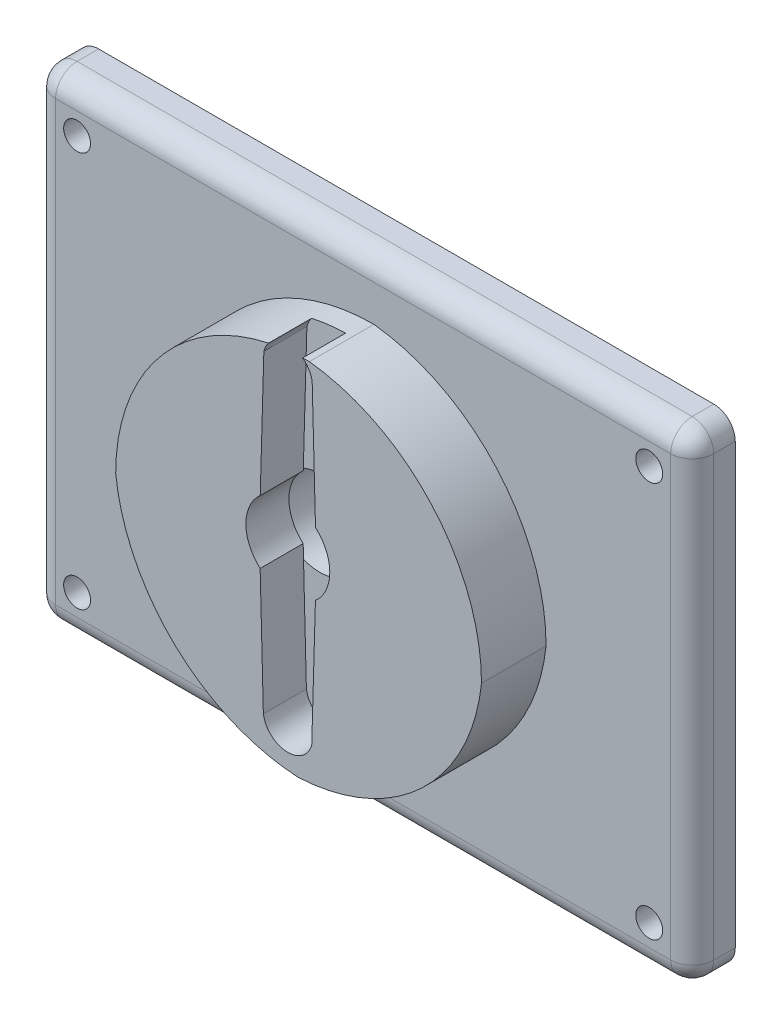
ISO-10303-21;
HEADER;
FILE_DESCRIPTION(('STEP AP214'),'2;1');
FILE_NAME('part.step','',(''),(''),'','','');
FILE_SCHEMA(('AUTOMOTIVE_DESIGN { 1 0 10303 214 1 1 1 1 }'));
ENDSEC;
DATA;
#1=APPLICATION_CONTEXT('core data for automotive mechanical design processes');
#2=APPLICATION_PROTOCOL_DEFINITION('international standard','automotive_design',2000,#1);
#3=PRODUCT_CONTEXT('',#1,'mechanical');
#4=PRODUCT('Part','Part','',(#3));
#5=PRODUCT_RELATED_PRODUCT_CATEGORY('part','',(#4));
#6=PRODUCT_DEFINITION_FORMATION('','',#4);
#7=PRODUCT_DEFINITION_CONTEXT('part definition',#1,'design');
#8=PRODUCT_DEFINITION('design','',#6,#7);
#9=PRODUCT_DEFINITION_SHAPE('','',#8);
#10=(LENGTH_UNIT() NAMED_UNIT(*) SI_UNIT(.MILLI.,.METRE.));
#11=(NAMED_UNIT(*) PLANE_ANGLE_UNIT() SI_UNIT($,.RADIAN.));
#12=(NAMED_UNIT(*) SI_UNIT($,.STERADIAN.) SOLID_ANGLE_UNIT());
#13=UNCERTAINTY_MEASURE_WITH_UNIT(LENGTH_MEASURE(1.E-05),#10,'distance_accuracy_value','');
#14=(GEOMETRIC_REPRESENTATION_CONTEXT(3) GLOBAL_UNCERTAINTY_ASSIGNED_CONTEXT((#13)) GLOBAL_UNIT_ASSIGNED_CONTEXT((#10,
#11,#12)) REPRESENTATION_CONTEXT('',''));
#15=CARTESIAN_POINT('',(0.,0.,0.));
#16=DIRECTION('',(0.,0.,1.));
#17=DIRECTION('',(1.,0.,0.));
#18=AXIS2_PLACEMENT_3D('',#15,#16,#17);
#19=CARTESIAN_POINT('',(0.,0.,10.));
#20=DIRECTION('',(0.,0.,-1.));
#21=DIRECTION('',(-1.,0.,0.));
#22=AXIS2_PLACEMENT_3D('',#19,#20,#21);
#23=PLANE('',#22);
#24=CARTESIAN_POINT('',(31.4730438199983,23.376,10.));
#25=DIRECTION('',(0.,0.,-1.));
#26=DIRECTION('',(-1.,0.,0.));
#27=AXIS2_PLACEMENT_3D('',#24,#25,#26);
#28=CIRCLE('',#27,18.);
#29=CARTESIAN_POINT('',(13.5845,21.376,10.));
#30=VERTEX_POINT('',#29);
#31=CARTESIAN_POINT('',(30.5784450690404,5.39824449285216,10.));
#32=VERTEX_POINT('',#31);
#33=EDGE_CURVE('E333',#30,#32,#28,.F.);
#34=ORIENTED_EDGE('',*,*,#33,.T.);
#35=CARTESIAN_POINT('',(29.6838463180825,23.376,10.));
#36=DIRECTION('',(0.,0.,-1.));
#37=DIRECTION('',(-1.,0.,0.));
#38=AXIS2_PLACEMENT_3D('',#35,#36,#37);
#39=CIRCLE('',#38,18.);
#40=CARTESIAN_POINT('',(47.5845,21.4874561800017,10.));
#41=VERTEX_POINT('',#40);
#42=EDGE_CURVE('E340',#32,#41,#39,.F.);
#43=ORIENTED_EDGE('',*,*,#42,.T.);
#44=CARTESIAN_POINT('',(29.5845,21.4874561800017,10.));
#45=DIRECTION('',(0.,0.,-1.));
#46=DIRECTION('',(-1.,0.,0.));
#47=AXIS2_PLACEMENT_3D('',#44,#45,#46);
#48=CIRCLE('',#47,18.);
#49=CARTESIAN_POINT('',(31.5845,39.376,10.));
#50=VERTEX_POINT('',#49);
#51=EDGE_CURVE('E328',#41,#50,#48,.F.);
#52=ORIENTED_EDGE('',*,*,#51,.T.);
#53=CARTESIAN_POINT('',(31.5845,21.376,10.));
#54=DIRECTION('',(0.,0.,-1.));
#55=DIRECTION('',(-1.,0.,0.));
#56=AXIS2_PLACEMENT_3D('',#53,#54,#55);
#57=CIRCLE('',#56,18.);
#58=CARTESIAN_POINT('',(30.9653676588754,39.3653489360836,10.));
#59=VERTEX_POINT('',#58);
#60=EDGE_CURVE('E314',#50,#59,#57,.F.);
#61=ORIENTED_EDGE('',*,*,#60,.T.);
#62=CARTESIAN_POINT('',(29.5845,37.526,10.));
#63=DIRECTION('',(0.,0.,-1.));
#64=DIRECTION('',(-1.,0.,0.));
#65=AXIS2_PLACEMENT_3D('',#62,#63,#64);
#66=CIRCLE('',#65,2.3);
#67=CARTESIAN_POINT('',(31.8465695845199,37.941982204896,10.));
#68=VERTEX_POINT('',#67);
#69=EDGE_CURVE('E224',#68,#59,#66,.F.);
#70=ORIENTED_EDGE('',*,*,#69,.F.);
#71=DIRECTION('',(0.0266231898565688,-0.999645540060006,0.));
#72=VECTOR('',#71,1.);
#73=CARTESIAN_POINT('',(31.8465695845199,37.941982204896,10.));
#74=LINE('',#73,#72);
#75=CARTESIAN_POINT('',(32.1564194587307,26.3077623194594,10.));
#76=VERTEX_POINT('',#75);
#77=EDGE_CURVE('E265',#68,#76,#74,.T.);
#78=ORIENTED_EDGE('',*,*,#77,.T.);
#79=CARTESIAN_POINT('',(29.5845,23.376,10.));
#80=DIRECTION('',(0.,0.,1.));
#81=DIRECTION('',(1.,0.,0.));
#82=AXIS2_PLACEMENT_3D('',#79,#80,#81);
#83=CIRCLE('',#82,3.9);
#84=CARTESIAN_POINT('',(32.1492781436771,20.4379882447961,10.));
#85=VERTEX_POINT('',#84);
#86=EDGE_CURVE('E262',#85,#76,#83,.T.);
#87=ORIENTED_EDGE('',*,*,#86,.F.);
#88=DIRECTION('',(0.0289944472045082,0.999579572636068,0.));
#89=VECTOR('',#88,1.);
#90=CARTESIAN_POINT('',(31.8068691014766,8.63348369068694,10.));
#91=LINE('',#90,#89);
#92=CARTESIAN_POINT('',(31.8068691014766,8.63348369068694,10.));
#93=VERTEX_POINT('',#92);
#94=EDGE_CURVE('E259',#93,#85,#91,.T.);
#95=ORIENTED_EDGE('',*,*,#94,.F.);
#96=CARTESIAN_POINT('',(29.5845,9.226,10.));
#97=DIRECTION('',(0.,0.,1.));
#98=DIRECTION('',(1.,0.,0.));
#99=AXIS2_PLACEMENT_3D('',#96,#97,#98);
#100=CIRCLE('',#99,2.3);
#101=CARTESIAN_POINT('',(27.3091522710528,8.89015373699447,10.));
#102=VERTEX_POINT('',#101);
#103=EDGE_CURVE('E257',#102,#93,#100,.T.);
#104=ORIENTED_EDGE('',*,*,#103,.F.);
#105=DIRECTION('',(-0.0258546875604509,0.999665711691239,0.));
#106=VECTOR('',#105,1.);
#107=CARTESIAN_POINT('',(27.3091522710528,8.89015373699447,10.));
#108=LINE('',#107,#106);
#109=CARTESIAN_POINT('',(27.0102727432738,20.44626382916,10.));
#110=VERTEX_POINT('',#109);
#111=EDGE_CURVE('E276',#102,#110,#108,.T.);
#112=ORIENTED_EDGE('',*,*,#111,.T.);
#113=CARTESIAN_POINT('',(29.5845,23.376,10.));
#114=DIRECTION('',(0.,0.,1.));
#115=DIRECTION('',(1.,0.,0.));
#116=AXIS2_PLACEMENT_3D('',#113,#114,#115);
#117=CIRCLE('',#116,3.9);
#118=CARTESIAN_POINT('',(27.0186152299211,26.3130453429726,10.));
#119=VERTEX_POINT('',#118);
#120=EDGE_CURVE('E273',#119,#110,#117,.T.);
#121=ORIENTED_EDGE('',*,*,#120,.F.);
#122=DIRECTION('',(-0.0286276665837208,-0.999590144362164,0.));
#123=VECTOR('',#122,1.);
#124=CARTESIAN_POINT('',(27.3560496358206,38.0952178619725,10.));
#125=LINE('',#124,#123);
#126=CARTESIAN_POINT('',(27.3560496358206,38.0952178619725,10.));
#127=VERTEX_POINT('',#126);
#128=EDGE_CURVE('E271',#127,#119,#125,.T.);
#129=ORIENTED_EDGE('',*,*,#128,.F.);
#130=CARTESIAN_POINT('',(29.5845,37.526,10.));
#131=DIRECTION('',(0.,0.,-1.));
#132=DIRECTION('',(-1.,0.,0.));
#133=AXIS2_PLACEMENT_3D('',#130,#131,#132);
#134=CIRCLE('',#133,2.3);
#135=CARTESIAN_POINT('',(27.7966616343304,38.9729395212793,10.));
#136=VERTEX_POINT('',#135);
#137=EDGE_CURVE('E268',#127,#136,#134,.T.);
#138=ORIENTED_EDGE('',*,*,#137,.T.);
#139=CARTESIAN_POINT('',(31.5845,21.376,10.));
#140=DIRECTION('',(0.,0.,-1.));
#141=DIRECTION('',(-1.,0.,0.));
#142=AXIS2_PLACEMENT_3D('',#139,#140,#141);
#143=CIRCLE('',#142,18.);
#144=EDGE_CURVE('E312',#136,#30,#143,.F.);
#145=ORIENTED_EDGE('',*,*,#144,.T.);
#146=EDGE_LOOP('',(#34,#43,#52,#61,#70,#78,#87,#95,#104,#112,#121,#129,#138,#145));
#147=FACE_BOUND('',#146,.T.);
#148=ADVANCED_FACE('F46',(#147),#23,.F.);
#149=CARTESIAN_POINT('',(0.,44.752,4.));
#150=DIRECTION('',(0.,1.,0.));
#151=DIRECTION('',(0.,0.,1.));
#152=AXIS2_PLACEMENT_3D('',#149,#150,#151);
#153=PLANE('',#152);
#154=DIRECTION('',(1.,0.,0.));
#155=VECTOR('',#154,1.);
#156=CARTESIAN_POINT('',(0.,44.752,0.));
#157=LINE('',#156,#155);
#158=CARTESIAN_POINT('',(2.,44.752,0.));
#159=VERTEX_POINT('',#158);
#160=CARTESIAN_POINT('',(59.169,44.752,0.));
#161=VERTEX_POINT('',#160);
#162=EDGE_CURVE('E282',#159,#161,#157,.T.);
#163=ORIENTED_EDGE('',*,*,#162,.F.);
#164=DIRECTION('',(0.,0.,-1.));
#165=VECTOR('',#164,1.);
#166=CARTESIAN_POINT('',(2.,44.752,4.));
#167=LINE('',#166,#165);
#168=CARTESIAN_POINT('',(2.,44.752,2.));
#169=VERTEX_POINT('',#168);
#170=EDGE_CURVE('E402',#159,#169,#167,.F.);
#171=ORIENTED_EDGE('',*,*,#170,.T.);
#172=DIRECTION('',(1.,0.,0.));
#173=VECTOR('',#172,1.);
#174=CARTESIAN_POINT('',(0.,44.752,2.));
#175=LINE('',#174,#173);
#176=CARTESIAN_POINT('',(59.169,44.752,2.));
#177=VERTEX_POINT('',#176);
#178=EDGE_CURVE('E398',#169,#177,#175,.T.);
#179=ORIENTED_EDGE('',*,*,#178,.T.);
#180=DIRECTION('',(0.,0.,-1.));
#181=VECTOR('',#180,1.);
#182=CARTESIAN_POINT('',(59.169,44.752,0.));
#183=LINE('',#182,#181);
#184=EDGE_CURVE('E400',#177,#161,#183,.T.);
#185=ORIENTED_EDGE('',*,*,#184,.T.);
#186=EDGE_LOOP('',(#163,#171,#179,#185));
#187=FACE_BOUND('',#186,.T.);
#188=ADVANCED_FACE('F428',(#187),#153,.T.);
#189=CARTESIAN_POINT('',(0.,0.,4.));
#190=DIRECTION('',(-1.,0.,0.));
#191=DIRECTION('',(0.,0.,1.));
#192=AXIS2_PLACEMENT_3D('',#189,#190,#191);
#193=PLANE('',#192);
#194=DIRECTION('',(0.,1.,0.));
#195=VECTOR('',#194,1.);
#196=CARTESIAN_POINT('',(0.,0.,2.));
#197=LINE('',#196,#195);
#198=CARTESIAN_POINT('',(0.,2.,2.));
#199=VERTEX_POINT('',#198);
#200=CARTESIAN_POINT('',(0.,42.752,2.));
#201=VERTEX_POINT('',#200);
#202=EDGE_CURVE('E377',#199,#201,#197,.T.);
#203=ORIENTED_EDGE('',*,*,#202,.T.);
#204=DIRECTION('',(0.,0.,-1.));
#205=VECTOR('',#204,1.);
#206=CARTESIAN_POINT('',(0.,42.752,4.));
#207=LINE('',#206,#205);
#208=CARTESIAN_POINT('',(0.,42.752,0.));
#209=VERTEX_POINT('',#208);
#210=EDGE_CURVE('E386',#201,#209,#207,.T.);
#211=ORIENTED_EDGE('',*,*,#210,.T.);
#212=DIRECTION('',(0.,1.,0.));
#213=VECTOR('',#212,1.);
#214=CARTESIAN_POINT('',(0.,0.,0.));
#215=LINE('',#214,#213);
#216=CARTESIAN_POINT('',(0.,2.,0.));
#217=VERTEX_POINT('',#216);
#218=EDGE_CURVE('E302',#217,#209,#215,.T.);
#219=ORIENTED_EDGE('',*,*,#218,.F.);
#220=DIRECTION('',(0.,0.,-1.));
#221=VECTOR('',#220,1.);
#222=CARTESIAN_POINT('',(0.,2.,2.));
#223=LINE('',#222,#221);
#224=EDGE_CURVE('E380',#217,#199,#223,.F.);
#225=ORIENTED_EDGE('',*,*,#224,.T.);
#226=EDGE_LOOP('',(#203,#211,#219,#225));
#227=FACE_BOUND('',#226,.T.);
#228=ADVANCED_FACE('F438',(#227),#193,.T.);
#229=CARTESIAN_POINT('',(0.,0.,4.));
#230=DIRECTION('',(0.,1.,0.));
#231=DIRECTION('',(0.,0.,1.));
#232=AXIS2_PLACEMENT_3D('',#229,#230,#231);
#233=PLANE('',#232);
#234=DIRECTION('',(1.,0.,0.));
#235=VECTOR('',#234,1.);
#236=CARTESIAN_POINT('',(0.,0.,2.));
#237=LINE('',#236,#235);
#238=CARTESIAN_POINT('',(59.169,0.,2.));
#239=VERTEX_POINT('',#238);
#240=CARTESIAN_POINT('',(2.,0.,2.));
#241=VERTEX_POINT('',#240);
#242=EDGE_CURVE('E346',#239,#241,#237,.F.);
#243=ORIENTED_EDGE('',*,*,#242,.T.);
#244=DIRECTION('',(0.,0.,-1.));
#245=VECTOR('',#244,1.);
#246=CARTESIAN_POINT('',(2.,0.,0.));
#247=LINE('',#246,#245);
#248=CARTESIAN_POINT('',(2.,0.,0.));
#249=VERTEX_POINT('',#248);
#250=EDGE_CURVE('E364',#241,#249,#247,.T.);
#251=ORIENTED_EDGE('',*,*,#250,.T.);
#252=DIRECTION('',(1.,0.,0.));
#253=VECTOR('',#252,1.);
#254=CARTESIAN_POINT('',(0.,0.,0.));
#255=LINE('',#254,#253);
#256=CARTESIAN_POINT('',(59.169,0.,0.));
#257=VERTEX_POINT('',#256);
#258=EDGE_CURVE('E300',#249,#257,#255,.T.);
#259=ORIENTED_EDGE('',*,*,#258,.T.);
#260=DIRECTION('',(0.,0.,-1.));
#261=VECTOR('',#260,1.);
#262=CARTESIAN_POINT('',(59.169,0.,4.));
#263=LINE('',#262,#261);
#264=EDGE_CURVE('E357',#257,#239,#263,.F.);
#265=ORIENTED_EDGE('',*,*,#264,.T.);
#266=EDGE_LOOP('',(#243,#251,#259,#265));
#267=FACE_BOUND('',#266,.T.);
#268=ADVANCED_FACE('F464',(#267),#233,.F.);
#269=CARTESIAN_POINT('',(61.169,0.,4.));
#270=DIRECTION('',(-1.,0.,0.));
#271=DIRECTION('',(0.,0.,1.));
#272=AXIS2_PLACEMENT_3D('',#269,#270,#271);
#273=PLANE('',#272);
#274=DIRECTION('',(0.,1.,0.));
#275=VECTOR('',#274,1.);
#276=CARTESIAN_POINT('',(61.169,0.,0.));
#277=LINE('',#276,#275);
#278=CARTESIAN_POINT('',(61.169,2.,0.));
#279=VERTEX_POINT('',#278);
#280=CARTESIAN_POINT('',(61.169,42.752,0.));
#281=VERTEX_POINT('',#280);
#282=EDGE_CURVE('E298',#279,#281,#277,.T.);
#283=ORIENTED_EDGE('',*,*,#282,.T.);
#284=DIRECTION('',(0.,0.,-1.));
#285=VECTOR('',#284,1.);
#286=CARTESIAN_POINT('',(61.169,42.752,2.));
#287=LINE('',#286,#285);
#288=CARTESIAN_POINT('',(61.169,42.752,2.));
#289=VERTEX_POINT('',#288);
#290=EDGE_CURVE('E70',#281,#289,#287,.F.);
#291=ORIENTED_EDGE('',*,*,#290,.T.);
#292=DIRECTION('',(0.,1.,0.));
#293=VECTOR('',#292,1.);
#294=CARTESIAN_POINT('',(61.169,2.,2.));
#295=LINE('',#294,#293);
#296=CARTESIAN_POINT('',(61.169,2.,2.));
#297=VERTEX_POINT('',#296);
#298=EDGE_CURVE('E349',#289,#297,#295,.F.);
#299=ORIENTED_EDGE('',*,*,#298,.T.);
#300=DIRECTION('',(0.,0.,-1.));
#301=VECTOR('',#300,1.);
#302=CARTESIAN_POINT('',(61.169,2.,4.));
#303=LINE('',#302,#301);
#304=EDGE_CURVE('E351',#297,#279,#303,.T.);
#305=ORIENTED_EDGE('',*,*,#304,.T.);
#306=EDGE_LOOP('',(#283,#291,#299,#305));
#307=FACE_BOUND('',#306,.T.);
#308=ADVANCED_FACE('F475',(#307),#273,.F.);
#309=CARTESIAN_POINT('',(0.,0.,4.));
#310=DIRECTION('',(0.,0.,1.));
#311=DIRECTION('',(1.,0.,0.));
#312=AXIS2_PLACEMENT_3D('',#309,#310,#311);
#313=PLANE('',#312);
#314=CARTESIAN_POINT('',(57.169,40.752,4.));
#315=DIRECTION('',(0.,0.,1.));
#316=DIRECTION('',(1.,0.,0.));
#317=AXIS2_PLACEMENT_3D('',#314,#315,#316);
#318=CIRCLE('',#317,1.25);
#319=CARTESIAN_POINT('',(58.419,40.752,4.));
#320=VERTEX_POINT('',#319);
#321=EDGE_CURVE('E878',#320,#320,#318,.T.);
#322=ORIENTED_EDGE('',*,*,#321,.F.);
#323=EDGE_LOOP('',(#322));
#324=FACE_BOUND('',#323,.T.);
#325=CARTESIAN_POINT('',(4.,4.,4.));
#326=DIRECTION('',(0.,0.,1.));
#327=DIRECTION('',(1.,0.,0.));
#328=AXIS2_PLACEMENT_3D('',#325,#326,#327);
#329=CIRCLE('',#328,1.25);
#330=CARTESIAN_POINT('',(5.25,4.,4.));
#331=VERTEX_POINT('',#330);
#332=EDGE_CURVE('E884',#331,#331,#329,.T.);
#333=ORIENTED_EDGE('',*,*,#332,.F.);
#334=EDGE_LOOP('',(#333));
#335=FACE_BOUND('',#334,.T.);
#336=CARTESIAN_POINT('',(57.169,4.,4.));
#337=DIRECTION('',(0.,0.,1.));
#338=DIRECTION('',(1.,0.,0.));
#339=AXIS2_PLACEMENT_3D('',#336,#337,#338);
#340=CIRCLE('',#339,1.25);
#341=CARTESIAN_POINT('',(58.419,4.,4.));
#342=VERTEX_POINT('',#341);
#343=EDGE_CURVE('E885',#342,#342,#340,.T.);
#344=ORIENTED_EDGE('',*,*,#343,.F.);
#345=EDGE_LOOP('',(#344));
#346=FACE_BOUND('',#345,.T.);
#347=CARTESIAN_POINT('',(4.,40.752,4.));
#348=DIRECTION('',(0.,0.,1.));
#349=DIRECTION('',(1.,0.,0.));
#350=AXIS2_PLACEMENT_3D('',#347,#348,#349);
#351=CIRCLE('',#350,1.25);
#352=CARTESIAN_POINT('',(5.25,40.752,4.));
#353=VERTEX_POINT('',#352);
#354=EDGE_CURVE('E875',#353,#353,#351,.T.);
#355=ORIENTED_EDGE('',*,*,#354,.F.);
#356=EDGE_LOOP('',(#355));
#357=FACE_BOUND('',#356,.T.);
#358=CARTESIAN_POINT('',(29.5845,21.4874561800017,4.));
#359=DIRECTION('',(0.,0.,1.));
#360=DIRECTION('',(1.,0.,0.));
#361=AXIS2_PLACEMENT_3D('',#358,#359,#360);
#362=CIRCLE('',#361,18.);
#363=CARTESIAN_POINT('',(31.5845,39.376,4.));
#364=VERTEX_POINT('',#363);
#365=CARTESIAN_POINT('',(47.5845,21.4874561800017,4.));
#366=VERTEX_POINT('',#365);
#367=EDGE_CURVE('E330',#364,#366,#362,.F.);
#368=ORIENTED_EDGE('',*,*,#367,.T.);
#369=CARTESIAN_POINT('',(29.6838463180825,23.376,4.));
#370=DIRECTION('',(0.,0.,1.));
#371=DIRECTION('',(1.,0.,0.));
#372=AXIS2_PLACEMENT_3D('',#369,#370,#371);
#373=CIRCLE('',#372,18.);
#374=CARTESIAN_POINT('',(30.5784450690404,5.39824449285216,4.));
#375=VERTEX_POINT('',#374);
#376=EDGE_CURVE('E342',#366,#375,#373,.F.);
#377=ORIENTED_EDGE('',*,*,#376,.T.);
#378=CARTESIAN_POINT('',(31.4730438199983,23.376,4.));
#379=DIRECTION('',(0.,0.,1.));
#380=DIRECTION('',(1.,0.,0.));
#381=AXIS2_PLACEMENT_3D('',#378,#379,#380);
#382=CIRCLE('',#381,18.);
#383=CARTESIAN_POINT('',(13.5845,21.376,4.));
#384=VERTEX_POINT('',#383);
#385=EDGE_CURVE('E336',#375,#384,#382,.F.);
#386=ORIENTED_EDGE('',*,*,#385,.T.);
#387=CARTESIAN_POINT('',(31.5845,21.376,4.));
#388=DIRECTION('',(0.,0.,1.));
#389=DIRECTION('',(1.,0.,0.));
#390=AXIS2_PLACEMENT_3D('',#387,#388,#389);
#391=CIRCLE('',#390,18.);
#392=EDGE_CURVE('E322',#384,#364,#391,.F.);
#393=ORIENTED_EDGE('',*,*,#392,.T.);
#394=EDGE_LOOP('',(#368,#377,#386,#393));
#395=FACE_BOUND('',#394,.T.);
#396=DIRECTION('',(0.,1.,0.));
#397=VECTOR('',#396,1.);
#398=CARTESIAN_POINT('',(59.169,44.752,4.));
#399=LINE('',#398,#397);
#400=CARTESIAN_POINT('',(59.169,2.,4.));
#401=VERTEX_POINT('',#400);
#402=CARTESIAN_POINT('',(59.169,42.752,4.));
#403=VERTEX_POINT('',#402);
#404=EDGE_CURVE('E362',#401,#403,#399,.T.);
#405=ORIENTED_EDGE('',*,*,#404,.T.);
#406=DIRECTION('',(1.,0.,0.));
#407=VECTOR('',#406,1.);
#408=CARTESIAN_POINT('',(0.,42.752,4.));
#409=LINE('',#408,#407);
#410=CARTESIAN_POINT('',(2.,42.752,4.));
#411=VERTEX_POINT('',#410);
#412=EDGE_CURVE('E12',#403,#411,#409,.F.);
#413=ORIENTED_EDGE('',*,*,#412,.T.);
#414=DIRECTION('',(0.,1.,0.));
#415=VECTOR('',#414,1.);
#416=CARTESIAN_POINT('',(2.,0.,4.));
#417=LINE('',#416,#415);
#418=CARTESIAN_POINT('',(2.,2.,4.));
#419=VERTEX_POINT('',#418);
#420=EDGE_CURVE('E384',#411,#419,#417,.F.);
#421=ORIENTED_EDGE('',*,*,#420,.T.);
#422=DIRECTION('',(1.,0.,0.));
#423=VECTOR('',#422,1.);
#424=CARTESIAN_POINT('',(61.169,2.,4.));
#425=LINE('',#424,#423);
#426=EDGE_CURVE('E344',#419,#401,#425,.T.);
#427=ORIENTED_EDGE('',*,*,#426,.T.);
#428=EDGE_LOOP('',(#405,#413,#421,#427));
#429=FACE_BOUND('',#428,.T.);
#430=ADVANCED_FACE('F451',(#324,#335,#346,#357,#395,#429),#313,.T.);
#431=CARTESIAN_POINT('',(0.,0.,0.));
#432=DIRECTION('',(0.,0.,1.));
#433=DIRECTION('',(1.,0.,0.));
#434=AXIS2_PLACEMENT_3D('',#431,#432,#433);
#435=PLANE('',#434);
#436=CARTESIAN_POINT('',(57.169,40.752,0.));
#437=DIRECTION('',(0.,0.,1.));
#438=DIRECTION('',(1.,0.,0.));
#439=AXIS2_PLACEMENT_3D('',#436,#437,#438);
#440=CIRCLE('',#439,1.25);
#441=CARTESIAN_POINT('',(58.419,40.752,0.));
#442=VERTEX_POINT('',#441);
#443=EDGE_CURVE('E888',#442,#442,#440,.T.);
#444=ORIENTED_EDGE('',*,*,#443,.T.);
#445=EDGE_LOOP('',(#444));
#446=FACE_BOUND('',#445,.T.);
#447=CARTESIAN_POINT('',(4.,4.,0.));
#448=DIRECTION('',(0.,0.,1.));
#449=DIRECTION('',(1.,0.,0.));
#450=AXIS2_PLACEMENT_3D('',#447,#448,#449);
#451=CIRCLE('',#450,1.25);
#452=CARTESIAN_POINT('',(5.25,4.,0.));
#453=VERTEX_POINT('',#452);
#454=EDGE_CURVE('E881',#453,#453,#451,.T.);
#455=ORIENTED_EDGE('',*,*,#454,.T.);
#456=EDGE_LOOP('',(#455));
#457=FACE_BOUND('',#456,.T.);
#458=CARTESIAN_POINT('',(57.169,4.,0.));
#459=DIRECTION('',(0.,0.,1.));
#460=DIRECTION('',(1.,0.,0.));
#461=AXIS2_PLACEMENT_3D('',#458,#459,#460);
#462=CIRCLE('',#461,1.25);
#463=CARTESIAN_POINT('',(58.419,4.,0.));
#464=VERTEX_POINT('',#463);
#465=EDGE_CURVE('E372',#464,#464,#462,.T.);
#466=ORIENTED_EDGE('',*,*,#465,.T.);
#467=EDGE_LOOP('',(#466));
#468=FACE_BOUND('',#467,.T.);
#469=CARTESIAN_POINT('',(4.,40.752,0.));
#470=DIRECTION('',(0.,0.,1.));
#471=DIRECTION('',(1.,0.,0.));
#472=AXIS2_PLACEMENT_3D('',#469,#470,#471);
#473=CIRCLE('',#472,1.25);
#474=CARTESIAN_POINT('',(5.25,40.752,0.));
#475=VERTEX_POINT('',#474);
#476=EDGE_CURVE('E234',#475,#475,#473,.T.);
#477=ORIENTED_EDGE('',*,*,#476,.T.);
#478=EDGE_LOOP('',(#477));
#479=FACE_BOUND('',#478,.T.);
#480=CARTESIAN_POINT('',(28.564891976784,22.8699087503271,0.));
#481=DIRECTION('',(0.,0.,1.));
#482=DIRECTION('',(1.,0.,0.));
#483=AXIS2_PLACEMENT_3D('',#480,#481,#482);
#484=CIRCLE('',#483,3.96926551243975);
#485=CARTESIAN_POINT('',(32.5341574892237,22.8699087503271,0.));
#486=VERTEX_POINT('',#485);
#487=EDGE_CURVE('E233',#486,#486,#484,.T.);
#488=ORIENTED_EDGE('',*,*,#487,.T.);
#489=EDGE_LOOP('',(#488));
#490=FACE_BOUND('',#489,.T.);
#491=ORIENTED_EDGE('',*,*,#218,.T.);
#492=CARTESIAN_POINT('',(2.,42.752,0.));
#493=DIRECTION('',(0.,0.,1.));
#494=DIRECTION('',(1.,0.,0.));
#495=AXIS2_PLACEMENT_3D('',#492,#493,#494);
#496=CIRCLE('',#495,2.);
#497=EDGE_CURVE('E396',#209,#159,#496,.F.);
#498=ORIENTED_EDGE('',*,*,#497,.T.);
#499=ORIENTED_EDGE('',*,*,#162,.T.);
#500=CARTESIAN_POINT('',(59.169,42.752,0.));
#501=DIRECTION('',(0.,0.,1.));
#502=DIRECTION('',(1.,0.,0.));
#503=AXIS2_PLACEMENT_3D('',#500,#501,#502);
#504=CIRCLE('',#503,2.);
#505=EDGE_CURVE('E394',#161,#281,#504,.F.);
#506=ORIENTED_EDGE('',*,*,#505,.T.);
#507=ORIENTED_EDGE('',*,*,#282,.F.);
#508=CARTESIAN_POINT('',(59.169,2.,0.));
#509=DIRECTION('',(0.,0.,1.));
#510=DIRECTION('',(1.,0.,0.));
#511=AXIS2_PLACEMENT_3D('',#508,#509,#510);
#512=CIRCLE('',#511,2.);
#513=EDGE_CURVE('E354',#279,#257,#512,.F.);
#514=ORIENTED_EDGE('',*,*,#513,.T.);
#515=ORIENTED_EDGE('',*,*,#258,.F.);
#516=CARTESIAN_POINT('',(2.,2.,0.));
#517=DIRECTION('',(0.,0.,1.));
#518=DIRECTION('',(1.,0.,0.));
#519=AXIS2_PLACEMENT_3D('',#516,#517,#518);
#520=CIRCLE('',#519,2.);
#521=EDGE_CURVE('E375',#249,#217,#520,.F.);
#522=ORIENTED_EDGE('',*,*,#521,.T.);
#523=EDGE_LOOP('',(#491,#498,#499,#506,#507,#514,#515,#522));
#524=FACE_BOUND('',#523,.T.);
#525=ADVANCED_FACE('F431',(#446,#457,#468,#479,#490,#524),#435,.F.);
#526=CARTESIAN_POINT('',(29.5845,37.526,6.));
#527=DIRECTION('',(0.,0.,1.));
#528=DIRECTION('',(1.,0.,0.));
#529=AXIS2_PLACEMENT_3D('',#526,#527,#528);
#530=CYLINDRICAL_SURFACE('',#529,2.3);
#531=CARTESIAN_POINT('',(29.5845,37.526,6.));
#532=DIRECTION('',(0.,0.,-1.));
#533=DIRECTION('',(-1.,0.,0.));
#534=AXIS2_PLACEMENT_3D('',#531,#532,#533);
#535=CIRCLE('',#534,2.3);
#536=CARTESIAN_POINT('',(27.3560496358206,38.0952178619725,6.));
#537=VERTEX_POINT('',#536);
#538=CARTESIAN_POINT('',(27.7966616343304,38.9729395212793,6.));
#539=VERTEX_POINT('',#538);
#540=EDGE_CURVE('E243',#537,#539,#535,.T.);
#541=ORIENTED_EDGE('',*,*,#540,.T.);
#542=DIRECTION('',(0.,0.,1.));
#543=VECTOR('',#542,1.);
#544=CARTESIAN_POINT('',(27.7966616343304,38.9729395212793,6.));
#545=LINE('',#544,#543);
#546=EDGE_CURVE('E320',#539,#136,#545,.T.);
#547=ORIENTED_EDGE('',*,*,#546,.T.);
#548=ORIENTED_EDGE('',*,*,#137,.F.);
#549=DIRECTION('',(0.,0.,1.));
#550=VECTOR('',#549,1.);
#551=CARTESIAN_POINT('',(27.3560496358206,38.0952178619725,6.));
#552=LINE('',#551,#550);
#553=EDGE_CURVE('E286',#537,#127,#552,.T.);
#554=ORIENTED_EDGE('',*,*,#553,.F.);
#555=EDGE_LOOP('',(#541,#547,#548,#554));
#556=FACE_BOUND('',#555,.T.);
#557=ADVANCED_FACE('F504',(#556),#530,.F.);
#558=CARTESIAN_POINT('',(29.5845,9.226,6.));
#559=DIRECTION('',(0.,0.,1.));
#560=DIRECTION('',(1.,0.,0.));
#561=AXIS2_PLACEMENT_3D('',#558,#559,#560);
#562=CYLINDRICAL_SURFACE('',#561,2.3);
#563=ORIENTED_EDGE('',*,*,#103,.T.);
#564=DIRECTION('',(0.,0.,1.));
#565=VECTOR('',#564,1.);
#566=CARTESIAN_POINT('',(31.8068691014766,8.63348369068694,6.));
#567=LINE('',#566,#565);
#568=CARTESIAN_POINT('',(31.8068691014766,8.63348369068694,6.));
#569=VERTEX_POINT('',#568);
#570=EDGE_CURVE('E256',#569,#93,#567,.T.);
#571=ORIENTED_EDGE('',*,*,#570,.F.);
#572=CARTESIAN_POINT('',(29.5845,9.226,6.));
#573=DIRECTION('',(0.,0.,1.));
#574=DIRECTION('',(1.,0.,0.));
#575=AXIS2_PLACEMENT_3D('',#572,#573,#574);
#576=CIRCLE('',#575,2.3);
#577=CARTESIAN_POINT('',(27.3091522710528,8.89015373699447,6.));
#578=VERTEX_POINT('',#577);
#579=EDGE_CURVE('E279',#578,#569,#576,.T.);
#580=ORIENTED_EDGE('',*,*,#579,.F.);
#581=DIRECTION('',(0.,0.,1.));
#582=VECTOR('',#581,1.);
#583=CARTESIAN_POINT('',(27.3091522710528,8.89015373699447,6.));
#584=LINE('',#583,#582);
#585=EDGE_CURVE('E280',#578,#102,#584,.T.);
#586=ORIENTED_EDGE('',*,*,#585,.T.);
#587=EDGE_LOOP('',(#563,#571,#580,#586));
#588=FACE_BOUND('',#587,.T.);
#589=ADVANCED_FACE('F497',(#588),#562,.F.);
#590=CARTESIAN_POINT('',(27.3091522710528,8.89015373699447,6.));
#591=DIRECTION('',(0.999665711691239,0.0258546875604509,0.));
#592=DIRECTION('',(-0.0258546875604509,0.999665711691239,0.));
#593=AXIS2_PLACEMENT_3D('',#590,#591,#592);
#594=PLANE('',#593);
#595=ORIENTED_EDGE('',*,*,#111,.F.);
#596=ORIENTED_EDGE('',*,*,#585,.F.);
#597=DIRECTION('',(-0.0258546875604509,0.999665711691239,0.));
#598=VECTOR('',#597,1.);
#599=CARTESIAN_POINT('',(27.3091522710528,8.89015373699447,6.));
#600=LINE('',#599,#598);
#601=CARTESIAN_POINT('',(27.0423954276358,19.2042474230799,6.));
#602=VERTEX_POINT('',#601);
#603=EDGE_CURVE('E254',#578,#602,#600,.T.);
#604=ORIENTED_EDGE('',*,*,#603,.T.);
#605=CARTESIAN_POINT('',(27.0102727432738,20.44626382916,6.));
#606=VERTEX_POINT('',#605);
#607=EDGE_CURVE('E232',#602,#606,#600,.T.);
#608=ORIENTED_EDGE('',*,*,#607,.T.);
#609=DIRECTION('',(0.,0.,1.));
#610=VECTOR('',#609,1.);
#611=CARTESIAN_POINT('',(27.0102727432738,20.44626382916,6.));
#612=LINE('',#611,#610);
#613=EDGE_CURVE('E283',#606,#110,#612,.T.);
#614=ORIENTED_EDGE('',*,*,#613,.T.);
#615=EDGE_LOOP('',(#595,#596,#604,#608,#614));
#616=FACE_BOUND('',#615,.T.);
#617=ADVANCED_FACE('F743',(#616),#594,.T.);
#618=CARTESIAN_POINT('',(29.5845,23.376,6.));
#619=DIRECTION('',(0.,0.,1.));
#620=DIRECTION('',(1.,0.,0.));
#621=AXIS2_PLACEMENT_3D('',#618,#619,#620);
#622=CYLINDRICAL_SURFACE('',#621,3.9);
#623=ORIENTED_EDGE('',*,*,#120,.T.);
#624=ORIENTED_EDGE('',*,*,#613,.F.);
#625=CARTESIAN_POINT('',(29.5845,23.376,6.));
#626=DIRECTION('',(0.,0.,1.));
#627=DIRECTION('',(1.,0.,0.));
#628=AXIS2_PLACEMENT_3D('',#625,#626,#627);
#629=CIRCLE('',#628,3.9);
#630=CARTESIAN_POINT('',(27.0186152299211,26.3130453429726,6.));
#631=VERTEX_POINT('',#630);
#632=EDGE_CURVE('E249',#631,#606,#629,.T.);
#633=ORIENTED_EDGE('',*,*,#632,.F.);
#634=DIRECTION('',(0.,0.,1.));
#635=VECTOR('',#634,1.);
#636=CARTESIAN_POINT('',(27.0186152299211,26.3130453429726,6.));
#637=LINE('',#636,#635);
#638=EDGE_CURVE('E241',#631,#119,#637,.T.);
#639=ORIENTED_EDGE('',*,*,#638,.T.);
#640=EDGE_LOOP('',(#623,#624,#633,#639));
#641=FACE_BOUND('',#640,.T.);
#642=ADVANCED_FACE('F735',(#641),#622,.F.);
#643=CARTESIAN_POINT('',(27.3560496358206,38.0952178619725,6.));
#644=DIRECTION('',(-0.999590144362164,0.0286276665837208,0.));
#645=DIRECTION('',(-0.0286276665837208,-0.999590144362164,0.));
#646=AXIS2_PLACEMENT_3D('',#643,#644,#645);
#647=PLANE('',#646);
#648=ORIENTED_EDGE('',*,*,#128,.T.);
#649=ORIENTED_EDGE('',*,*,#638,.F.);
#650=DIRECTION('',(-0.0286276665837208,-0.999590144362164,0.));
#651=VECTOR('',#650,1.);
#652=CARTESIAN_POINT('',(27.3560496358206,38.0952178619725,6.));
#653=LINE('',#652,#651);
#654=CARTESIAN_POINT('',(27.024777210847,26.5282027811543,6.));
#655=VERTEX_POINT('',#654);
#656=EDGE_CURVE('E229',#655,#631,#653,.T.);
#657=ORIENTED_EDGE('',*,*,#656,.F.);
#658=EDGE_CURVE('E240',#537,#655,#653,.T.);
#659=ORIENTED_EDGE('',*,*,#658,.F.);
#660=ORIENTED_EDGE('',*,*,#553,.T.);
#661=EDGE_LOOP('',(#648,#649,#657,#659,#660));
#662=FACE_BOUND('',#661,.T.);
#663=ADVANCED_FACE('F239',(#662),#647,.F.);
#664=ORIENTED_EDGE('',*,*,#69,.T.);
#665=DIRECTION('',(0.,0.,1.));
#666=VECTOR('',#665,1.);
#667=CARTESIAN_POINT('',(30.9653676588754,39.3653489360836,10.));
#668=LINE('',#667,#666);
#669=CARTESIAN_POINT('',(30.9653676588754,39.3653489360836,6.));
#670=VERTEX_POINT('',#669);
#671=EDGE_CURVE('E316',#59,#670,#668,.F.);
#672=ORIENTED_EDGE('',*,*,#671,.T.);
#673=CARTESIAN_POINT('',(31.8465695845199,37.941982204896,6.));
#674=VERTEX_POINT('',#673);
#675=EDGE_CURVE('E833',#670,#674,#535,.T.);
#676=ORIENTED_EDGE('',*,*,#675,.T.);
#677=DIRECTION('',(0.,0.,1.));
#678=VECTOR('',#677,1.);
#679=CARTESIAN_POINT('',(31.8465695845199,37.941982204896,6.));
#680=LINE('',#679,#678);
#681=EDGE_CURVE('E288',#674,#68,#680,.T.);
#682=ORIENTED_EDGE('',*,*,#681,.T.);
#683=EDGE_LOOP('',(#664,#672,#676,#682));
#684=FACE_BOUND('',#683,.T.);
#685=ADVANCED_FACE('F718',(#684),#530,.F.);
#686=CARTESIAN_POINT('',(31.8465695845199,37.941982204896,6.));
#687=DIRECTION('',(-0.999645540060006,-0.0266231898565688,0.));
#688=DIRECTION('',(0.0266231898565688,-0.999645540060006,0.));
#689=AXIS2_PLACEMENT_3D('',#686,#687,#688);
#690=PLANE('',#689);
#691=ORIENTED_EDGE('',*,*,#77,.F.);
#692=ORIENTED_EDGE('',*,*,#681,.F.);
#693=DIRECTION('',(0.0266231898565688,-0.999645540060006,0.));
#694=VECTOR('',#693,1.);
#695=CARTESIAN_POINT('',(31.8465695845199,37.941982204896,6.));
#696=LINE('',#695,#694);
#697=CARTESIAN_POINT('',(32.1564194587307,26.3077623194594,6.));
#698=VERTEX_POINT('',#697);
#699=EDGE_CURVE('E858',#674,#698,#696,.T.);
#700=ORIENTED_EDGE('',*,*,#699,.T.);
#701=DIRECTION('',(0.,0.,1.));
#702=VECTOR('',#701,1.);
#703=CARTESIAN_POINT('',(32.1564194587307,26.3077623194594,6.));
#704=LINE('',#703,#702);
#705=EDGE_CURVE('E290',#698,#76,#704,.T.);
#706=ORIENTED_EDGE('',*,*,#705,.T.);
#707=EDGE_LOOP('',(#691,#692,#700,#706));
#708=FACE_BOUND('',#707,.T.);
#709=ADVANCED_FACE('F709',(#708),#690,.T.);
#710=CARTESIAN_POINT('',(29.5845,23.376,6.));
#711=DIRECTION('',(0.,0.,1.));
#712=DIRECTION('',(1.,0.,0.));
#713=AXIS2_PLACEMENT_3D('',#710,#711,#712);
#714=CYLINDRICAL_SURFACE('',#713,3.9);
#715=ORIENTED_EDGE('',*,*,#86,.T.);
#716=ORIENTED_EDGE('',*,*,#705,.F.);
#717=CARTESIAN_POINT('',(29.5845,23.376,6.));
#718=DIRECTION('',(0.,0.,1.));
#719=DIRECTION('',(1.,0.,0.));
#720=AXIS2_PLACEMENT_3D('',#717,#718,#719);
#721=CIRCLE('',#720,3.9);
#722=CARTESIAN_POINT('',(32.1492781436771,20.4379882447961,6.));
#723=VERTEX_POINT('',#722);
#724=EDGE_CURVE('E853',#723,#698,#721,.T.);
#725=ORIENTED_EDGE('',*,*,#724,.F.);
#726=DIRECTION('',(0.,0.,1.));
#727=VECTOR('',#726,1.);
#728=CARTESIAN_POINT('',(32.1492781436771,20.4379882447961,6.));
#729=LINE('',#728,#727);
#730=EDGE_CURVE('E292',#723,#85,#729,.T.);
#731=ORIENTED_EDGE('',*,*,#730,.T.);
#732=EDGE_LOOP('',(#715,#716,#725,#731));
#733=FACE_BOUND('',#732,.T.);
#734=ADVANCED_FACE('F701',(#733),#714,.F.);
#735=CARTESIAN_POINT('',(31.8068691014766,8.63348369068694,6.));
#736=DIRECTION('',(0.999579572636068,-0.0289944472045082,0.));
#737=DIRECTION('',(0.0289944472045082,0.999579572636068,0.));
#738=AXIS2_PLACEMENT_3D('',#735,#736,#737);
#739=PLANE('',#738);
#740=ORIENTED_EDGE('',*,*,#94,.T.);
#741=ORIENTED_EDGE('',*,*,#730,.F.);
#742=DIRECTION('',(0.0289944472045082,0.999579572636068,0.));
#743=VECTOR('',#742,1.);
#744=CARTESIAN_POINT('',(31.8068691014766,8.63348369068694,6.));
#745=LINE('',#744,#743);
#746=EDGE_CURVE('E851',#569,#723,#745,.T.);
#747=ORIENTED_EDGE('',*,*,#746,.F.);
#748=ORIENTED_EDGE('',*,*,#570,.T.);
#749=EDGE_LOOP('',(#740,#741,#747,#748));
#750=FACE_BOUND('',#749,.T.);
#751=ADVANCED_FACE('F693',(#750),#739,.F.);
#752=CARTESIAN_POINT('',(29.5845,9.226,6.));
#753=DIRECTION('',(0.,0.,1.));
#754=DIRECTION('',(1.,0.,0.));
#755=AXIS2_PLACEMENT_3D('',#752,#753,#754);
#756=PLANE('',#755);
#757=ORIENTED_EDGE('',*,*,#675,.F.);
#758=CARTESIAN_POINT('',(31.5845,21.376,6.));
#759=DIRECTION('',(0.,0.,1.));
#760=DIRECTION('',(1.,0.,0.));
#761=AXIS2_PLACEMENT_3D('',#758,#759,#760);
#762=CIRCLE('',#761,18.);
#763=EDGE_CURVE('E318',#670,#539,#762,.T.);
#764=ORIENTED_EDGE('',*,*,#763,.T.);
#765=ORIENTED_EDGE('',*,*,#540,.F.);
#766=ORIENTED_EDGE('',*,*,#658,.T.);
#767=CARTESIAN_POINT('',(28.564891976784,22.8699087503271,6.));
#768=DIRECTION('',(0.,0.,1.));
#769=DIRECTION('',(1.,0.,0.));
#770=AXIS2_PLACEMENT_3D('',#767,#768,#769);
#771=CIRCLE('',#770,3.96926551243975);
#772=EDGE_CURVE('E214',#602,#655,#771,.T.);
#773=ORIENTED_EDGE('',*,*,#772,.F.);
#774=ORIENTED_EDGE('',*,*,#603,.F.);
#775=ORIENTED_EDGE('',*,*,#579,.T.);
#776=ORIENTED_EDGE('',*,*,#746,.T.);
#777=ORIENTED_EDGE('',*,*,#724,.T.);
#778=ORIENTED_EDGE('',*,*,#699,.F.);
#779=EDGE_LOOP('',(#757,#764,#765,#766,#773,#774,#775,#776,#777,#778));
#780=FACE_BOUND('',#779,.T.);
#781=ADVANCED_FACE('F247',(#780),#756,.T.);
#782=CARTESIAN_POINT('',(28.564891976784,22.8699087503271,0.));
#783=DIRECTION('',(0.,0.,1.));
#784=DIRECTION('',(1.,0.,0.));
#785=AXIS2_PLACEMENT_3D('',#782,#783,#784);
#786=CYLINDRICAL_SURFACE('',#785,3.96926551243975);
#787=ORIENTED_EDGE('',*,*,#487,.F.);
#788=EDGE_LOOP('',(#787));
#789=FACE_BOUND('',#788,.T.);
#790=CARTESIAN_POINT('',(28.564891976784,22.8699087503271,6.));
#791=DIRECTION('',(0.,0.,1.));
#792=DIRECTION('',(1.,0.,0.));
#793=AXIS2_PLACEMENT_3D('',#790,#791,#792);
#794=CIRCLE('',#793,3.96926551243975);
#795=EDGE_CURVE('E217',#655,#602,#794,.T.);
#796=ORIENTED_EDGE('',*,*,#795,.T.);
#797=ORIENTED_EDGE('',*,*,#772,.T.);
#798=EDGE_LOOP('',(#796,#797));
#799=FACE_BOUND('',#798,.T.);
#800=ADVANCED_FACE('F216',(#789,#799),#786,.F.);
#801=CARTESIAN_POINT('',(28.564891976784,22.8699087503271,6.));
#802=DIRECTION('',(0.,0.,1.));
#803=DIRECTION('',(1.,0.,0.));
#804=AXIS2_PLACEMENT_3D('',#801,#802,#803);
#805=PLANE('',#804);
#806=ORIENTED_EDGE('',*,*,#607,.F.);
#807=ORIENTED_EDGE('',*,*,#795,.F.);
#808=ORIENTED_EDGE('',*,*,#656,.T.);
#809=ORIENTED_EDGE('',*,*,#632,.T.);
#810=EDGE_LOOP('',(#806,#807,#808,#809));
#811=FACE_BOUND('',#810,.T.);
#812=ADVANCED_FACE('F228',(#811),#805,.F.);
#813=CARTESIAN_POINT('',(31.5845,21.376,10.));
#814=DIRECTION('',(0.,0.,1.));
#815=DIRECTION('',(1.,0.,0.));
#816=AXIS2_PLACEMENT_3D('',#813,#814,#815);
#817=CYLINDRICAL_SURFACE('',#816,18.);
#818=ORIENTED_EDGE('',*,*,#60,.F.);
#819=DIRECTION('',(0.,0.,-1.));
#820=VECTOR('',#819,1.);
#821=CARTESIAN_POINT('',(31.5845,39.376,10.));
#822=LINE('',#821,#820);
#823=EDGE_CURVE('E309',#364,#50,#822,.F.);
#824=ORIENTED_EDGE('',*,*,#823,.F.);
#825=ORIENTED_EDGE('',*,*,#392,.F.);
#826=DIRECTION('',(0.,0.,-1.));
#827=VECTOR('',#826,1.);
#828=CARTESIAN_POINT('',(13.5845,21.376,4.));
#829=LINE('',#828,#827);
#830=EDGE_CURVE('E223',#30,#384,#829,.T.);
#831=ORIENTED_EDGE('',*,*,#830,.F.);
#832=ORIENTED_EDGE('',*,*,#144,.F.);
#833=ORIENTED_EDGE('',*,*,#546,.F.);
#834=ORIENTED_EDGE('',*,*,#763,.F.);
#835=ORIENTED_EDGE('',*,*,#671,.F.);
#836=EDGE_LOOP('',(#818,#824,#825,#831,#832,#833,#834,#835));
#837=FACE_BOUND('',#836,.T.);
#838=ADVANCED_FACE('F512',(#837),#817,.T.);
#839=CARTESIAN_POINT('',(29.5845,21.4874561800017,10.));
#840=DIRECTION('',(0.,0.,-1.));
#841=DIRECTION('',(-1.,0.,0.));
#842=AXIS2_PLACEMENT_3D('',#839,#840,#841);
#843=CYLINDRICAL_SURFACE('',#842,18.);
#844=ORIENTED_EDGE('',*,*,#51,.F.);
#845=DIRECTION('',(0.,0.,1.));
#846=VECTOR('',#845,1.);
#847=CARTESIAN_POINT('',(47.5845,21.4874561800017,10.));
#848=LINE('',#847,#846);
#849=EDGE_CURVE('E325',#366,#41,#848,.T.);
#850=ORIENTED_EDGE('',*,*,#849,.F.);
#851=ORIENTED_EDGE('',*,*,#367,.F.);
#852=ORIENTED_EDGE('',*,*,#823,.T.);
#853=EDGE_LOOP('',(#844,#850,#851,#852));
#854=FACE_BOUND('',#853,.T.);
#855=ADVANCED_FACE('F514',(#854),#843,.T.);
#856=CARTESIAN_POINT('',(31.4730438199983,23.376,10.));
#857=DIRECTION('',(0.,0.,-1.));
#858=DIRECTION('',(-1.,0.,0.));
#859=AXIS2_PLACEMENT_3D('',#856,#857,#858);
#860=CYLINDRICAL_SURFACE('',#859,18.);
#861=ORIENTED_EDGE('',*,*,#385,.F.);
#862=DIRECTION('',(0.,0.,1.));
#863=VECTOR('',#862,1.);
#864=CARTESIAN_POINT('',(30.5784450690404,5.39824449285216,7.));
#865=LINE('',#864,#863);
#866=EDGE_CURVE('E338',#375,#32,#865,.T.);
#867=ORIENTED_EDGE('',*,*,#866,.T.);
#868=ORIENTED_EDGE('',*,*,#33,.F.);
#869=ORIENTED_EDGE('',*,*,#830,.T.);
#870=EDGE_LOOP('',(#861,#867,#868,#869));
#871=FACE_BOUND('',#870,.T.);
#872=ADVANCED_FACE('F517',(#871),#860,.T.);
#873=CARTESIAN_POINT('',(29.6838463180825,23.376,10.));
#874=DIRECTION('',(0.,0.,1.));
#875=DIRECTION('',(1.,0.,0.));
#876=AXIS2_PLACEMENT_3D('',#873,#874,#875);
#877=CYLINDRICAL_SURFACE('',#876,18.);
#878=ORIENTED_EDGE('',*,*,#42,.F.);
#879=ORIENTED_EDGE('',*,*,#866,.F.);
#880=ORIENTED_EDGE('',*,*,#376,.F.);
#881=ORIENTED_EDGE('',*,*,#849,.T.);
#882=EDGE_LOOP('',(#878,#879,#880,#881));
#883=FACE_BOUND('',#882,.T.);
#884=ADVANCED_FACE('F521',(#883),#877,.T.);
#885=CARTESIAN_POINT('',(4.,40.752,0.));
#886=DIRECTION('',(0.,0.,1.));
#887=DIRECTION('',(1.,0.,0.));
#888=AXIS2_PLACEMENT_3D('',#885,#886,#887);
#889=CYLINDRICAL_SURFACE('',#888,1.25);
#890=ORIENTED_EDGE('',*,*,#476,.F.);
#891=EDGE_LOOP('',(#890));
#892=FACE_BOUND('',#891,.T.);
#893=ORIENTED_EDGE('',*,*,#354,.T.);
#894=EDGE_LOOP('',(#893));
#895=FACE_BOUND('',#894,.T.);
#896=ADVANCED_FACE('F525',(#892,#895),#889,.F.);
#897=CARTESIAN_POINT('',(57.169,4.,0.));
#898=DIRECTION('',(0.,0.,1.));
#899=DIRECTION('',(1.,0.,0.));
#900=AXIS2_PLACEMENT_3D('',#897,#898,#899);
#901=CYLINDRICAL_SURFACE('',#900,1.25);
#902=ORIENTED_EDGE('',*,*,#465,.F.);
#903=EDGE_LOOP('',(#902));
#904=FACE_BOUND('',#903,.T.);
#905=ORIENTED_EDGE('',*,*,#343,.T.);
#906=EDGE_LOOP('',(#905));
#907=FACE_BOUND('',#906,.T.);
#908=ADVANCED_FACE('F633',(#904,#907),#901,.F.);
#909=CARTESIAN_POINT('',(4.,4.,0.));
#910=DIRECTION('',(0.,0.,1.));
#911=DIRECTION('',(1.,0.,0.));
#912=AXIS2_PLACEMENT_3D('',#909,#910,#911);
#913=CYLINDRICAL_SURFACE('',#912,1.25);
#914=ORIENTED_EDGE('',*,*,#454,.F.);
#915=EDGE_LOOP('',(#914));
#916=FACE_BOUND('',#915,.T.);
#917=ORIENTED_EDGE('',*,*,#332,.T.);
#918=EDGE_LOOP('',(#917));
#919=FACE_BOUND('',#918,.T.);
#920=ADVANCED_FACE('F624',(#916,#919),#913,.F.);
#921=CARTESIAN_POINT('',(57.169,40.752,0.));
#922=DIRECTION('',(0.,0.,1.));
#923=DIRECTION('',(1.,0.,0.));
#924=AXIS2_PLACEMENT_3D('',#921,#922,#923);
#925=CYLINDRICAL_SURFACE('',#924,1.25);
#926=ORIENTED_EDGE('',*,*,#443,.F.);
#927=EDGE_LOOP('',(#926));
#928=FACE_BOUND('',#927,.T.);
#929=ORIENTED_EDGE('',*,*,#321,.T.);
#930=EDGE_LOOP('',(#929));
#931=FACE_BOUND('',#930,.T.);
#932=ADVANCED_FACE('F529',(#928,#931),#925,.F.);
#933=CARTESIAN_POINT('',(0.,2.,2.));
#934=DIRECTION('',(-1.,0.,0.));
#935=DIRECTION('',(0.,0.,1.));
#936=AXIS2_PLACEMENT_3D('',#933,#934,#935);
#937=CYLINDRICAL_SURFACE('',#936,2.);
#938=ORIENTED_EDGE('',*,*,#426,.F.);
#939=CARTESIAN_POINT('',(2.,2.,2.));
#940=DIRECTION('',(-1.,0.,0.));
#941=DIRECTION('',(0.,0.,1.));
#942=AXIS2_PLACEMENT_3D('',#939,#940,#941);
#943=CIRCLE('',#942,2.);
#944=EDGE_CURVE('E382',#419,#241,#943,.F.);
#945=ORIENTED_EDGE('',*,*,#944,.T.);
#946=ORIENTED_EDGE('',*,*,#242,.F.);
#947=CARTESIAN_POINT('',(59.169,2.,2.));
#948=DIRECTION('',(-1.,0.,0.));
#949=DIRECTION('',(0.,0.,1.));
#950=AXIS2_PLACEMENT_3D('',#947,#948,#949);
#951=CIRCLE('',#950,2.);
#952=EDGE_CURVE('E359',#239,#401,#951,.T.);
#953=ORIENTED_EDGE('',*,*,#952,.T.);
#954=EDGE_LOOP('',(#938,#945,#946,#953));
#955=FACE_BOUND('',#954,.T.);
#956=ADVANCED_FACE('F461',(#955),#937,.T.);
#957=CARTESIAN_POINT('',(59.169,0.,2.));
#958=DIRECTION('',(0.,-1.,0.));
#959=DIRECTION('',(0.,0.,-1.));
#960=AXIS2_PLACEMENT_3D('',#957,#958,#959);
#961=CYLINDRICAL_SURFACE('',#960,2.);
#962=ORIENTED_EDGE('',*,*,#298,.F.);
#963=CARTESIAN_POINT('',(59.169,42.752,2.));
#964=DIRECTION('',(0.,-1.,0.));
#965=DIRECTION('',(0.,0.,-1.));
#966=AXIS2_PLACEMENT_3D('',#963,#964,#965);
#967=CIRCLE('',#966,2.);
#968=EDGE_CURVE('E55',#289,#403,#967,.T.);
#969=ORIENTED_EDGE('',*,*,#968,.T.);
#970=ORIENTED_EDGE('',*,*,#404,.F.);
#971=CARTESIAN_POINT('',(59.169,2.,2.));
#972=DIRECTION('',(0.,-1.,0.));
#973=DIRECTION('',(0.,0.,-1.));
#974=AXIS2_PLACEMENT_3D('',#971,#972,#973);
#975=CIRCLE('',#974,2.);
#976=EDGE_CURVE('E368',#297,#401,#975,.T.);
#977=ORIENTED_EDGE('',*,*,#976,.F.);
#978=EDGE_LOOP('',(#962,#969,#970,#977));
#979=FACE_BOUND('',#978,.T.);
#980=ADVANCED_FACE('F474',(#979),#961,.T.);
#981=CARTESIAN_POINT('',(59.169,2.,2.));
#982=DIRECTION('',(-1.,0.,0.));
#983=DIRECTION('',(0.,0.,1.));
#984=AXIS2_PLACEMENT_3D('',#981,#982,#983);
#985=SPHERICAL_SURFACE('',#984,2.);
#986=ORIENTED_EDGE('',*,*,#976,.T.);
#987=ORIENTED_EDGE('',*,*,#952,.F.);
#988=CARTESIAN_POINT('',(59.169,2.,2.));
#989=DIRECTION('',(0.,0.,-1.));
#990=DIRECTION('',(-1.,0.,0.));
#991=AXIS2_PLACEMENT_3D('',#988,#989,#990);
#992=CIRCLE('',#991,2.);
#993=EDGE_CURVE('E365',#297,#239,#992,.T.);
#994=ORIENTED_EDGE('',*,*,#993,.F.);
#995=EDGE_LOOP('',(#986,#987,#994));
#996=FACE_BOUND('',#995,.T.);
#997=ADVANCED_FACE('F472',(#996),#985,.T.);
#998=CARTESIAN_POINT('',(59.169,2.,4.));
#999=DIRECTION('',(0.,0.,-1.));
#1000=DIRECTION('',(-1.,0.,0.));
#1001=AXIS2_PLACEMENT_3D('',#998,#999,#1000);
#1002=CYLINDRICAL_SURFACE('',#1001,2.);
#1003=ORIENTED_EDGE('',*,*,#993,.T.);
#1004=ORIENTED_EDGE('',*,*,#264,.F.);
#1005=ORIENTED_EDGE('',*,*,#513,.F.);
#1006=ORIENTED_EDGE('',*,*,#304,.F.);
#1007=EDGE_LOOP('',(#1003,#1004,#1005,#1006));
#1008=FACE_BOUND('',#1007,.T.);
#1009=ADVANCED_FACE('F468',(#1008),#1002,.T.);
#1010=CARTESIAN_POINT('',(2.,0.,2.));
#1011=DIRECTION('',(0.,1.,0.));
#1012=DIRECTION('',(0.,0.,1.));
#1013=AXIS2_PLACEMENT_3D('',#1010,#1011,#1012);
#1014=CYLINDRICAL_SURFACE('',#1013,2.);
#1015=ORIENTED_EDGE('',*,*,#420,.F.);
#1016=CARTESIAN_POINT('',(2.,42.752,2.));
#1017=DIRECTION('',(0.,1.,0.));
#1018=DIRECTION('',(0.,0.,1.));
#1019=AXIS2_PLACEMENT_3D('',#1016,#1017,#1018);
#1020=CIRCLE('',#1019,2.);
#1021=EDGE_CURVE('E404',#411,#201,#1020,.F.);
#1022=ORIENTED_EDGE('',*,*,#1021,.T.);
#1023=ORIENTED_EDGE('',*,*,#202,.F.);
#1024=CARTESIAN_POINT('',(2.,2.,2.));
#1025=DIRECTION('',(0.,-1.,0.));
#1026=DIRECTION('',(0.,0.,-1.));
#1027=AXIS2_PLACEMENT_3D('',#1024,#1025,#1026);
#1028=CIRCLE('',#1027,2.);
#1029=EDGE_CURVE('E369',#419,#199,#1028,.T.);
#1030=ORIENTED_EDGE('',*,*,#1029,.F.);
#1031=EDGE_LOOP('',(#1015,#1022,#1023,#1030));
#1032=FACE_BOUND('',#1031,.T.);
#1033=ADVANCED_FACE('F453',(#1032),#1014,.T.);
#1034=CARTESIAN_POINT('',(2.,2.,2.));
#1035=DIRECTION('',(-1.,0.,0.));
#1036=DIRECTION('',(0.,0.,1.));
#1037=AXIS2_PLACEMENT_3D('',#1034,#1035,#1036);
#1038=SPHERICAL_SURFACE('',#1037,2.);
#1039=ORIENTED_EDGE('',*,*,#944,.F.);
#1040=ORIENTED_EDGE('',*,*,#1029,.T.);
#1041=CARTESIAN_POINT('',(2.,2.,2.));
#1042=DIRECTION('',(0.,0.,-1.));
#1043=DIRECTION('',(-1.,0.,0.));
#1044=AXIS2_PLACEMENT_3D('',#1041,#1042,#1043);
#1045=CIRCLE('',#1044,2.);
#1046=EDGE_CURVE('E387',#241,#199,#1045,.T.);
#1047=ORIENTED_EDGE('',*,*,#1046,.F.);
#1048=EDGE_LOOP('',(#1039,#1040,#1047));
#1049=FACE_BOUND('',#1048,.T.);
#1050=ADVANCED_FACE('F457',(#1049),#1038,.T.);
#1051=CARTESIAN_POINT('',(2.,2.,4.));
#1052=DIRECTION('',(0.,0.,1.));
#1053=DIRECTION('',(1.,0.,0.));
#1054=AXIS2_PLACEMENT_3D('',#1051,#1052,#1053);
#1055=CYLINDRICAL_SURFACE('',#1054,2.);
#1056=ORIENTED_EDGE('',*,*,#1046,.T.);
#1057=ORIENTED_EDGE('',*,*,#224,.F.);
#1058=ORIENTED_EDGE('',*,*,#521,.F.);
#1059=ORIENTED_EDGE('',*,*,#250,.F.);
#1060=EDGE_LOOP('',(#1056,#1057,#1058,#1059));
#1061=FACE_BOUND('',#1060,.T.);
#1062=ADVANCED_FACE('F477',(#1061),#1055,.T.);
#1063=CARTESIAN_POINT('',(59.169,42.752,4.));
#1064=DIRECTION('',(0.,0.,1.));
#1065=DIRECTION('',(1.,0.,0.));
#1066=AXIS2_PLACEMENT_3D('',#1063,#1064,#1065);
#1067=CYLINDRICAL_SURFACE('',#1066,2.);
#1068=CARTESIAN_POINT('',(59.169,42.752,2.));
#1069=DIRECTION('',(0.,0.,1.));
#1070=DIRECTION('',(1.,0.,0.));
#1071=AXIS2_PLACEMENT_3D('',#1068,#1069,#1070);
#1072=CIRCLE('',#1071,2.);
#1073=EDGE_CURVE('E50',#289,#177,#1072,.T.);
#1074=ORIENTED_EDGE('',*,*,#1073,.F.);
#1075=ORIENTED_EDGE('',*,*,#290,.F.);
#1076=ORIENTED_EDGE('',*,*,#505,.F.);
#1077=ORIENTED_EDGE('',*,*,#184,.F.);
#1078=EDGE_LOOP('',(#1074,#1075,#1076,#1077));
#1079=FACE_BOUND('',#1078,.T.);
#1080=ADVANCED_FACE('F48',(#1079),#1067,.T.);
#1081=CARTESIAN_POINT('',(59.169,42.752,2.));
#1082=DIRECTION('',(0.,1.,0.));
#1083=DIRECTION('',(0.,0.,1.));
#1084=AXIS2_PLACEMENT_3D('',#1081,#1082,#1083);
#1085=SPHERICAL_SURFACE('',#1084,2.);
#1086=ORIENTED_EDGE('',*,*,#968,.F.);
#1087=ORIENTED_EDGE('',*,*,#1073,.T.);
#1088=CARTESIAN_POINT('',(59.169,42.752,2.));
#1089=DIRECTION('',(-1.,0.,0.));
#1090=DIRECTION('',(0.,0.,1.));
#1091=AXIS2_PLACEMENT_3D('',#1088,#1089,#1090);
#1092=CIRCLE('',#1091,2.);
#1093=EDGE_CURVE('E413',#403,#177,#1092,.T.);
#1094=ORIENTED_EDGE('',*,*,#1093,.F.);
#1095=EDGE_LOOP('',(#1086,#1087,#1094));
#1096=FACE_BOUND('',#1095,.T.);
#1097=ADVANCED_FACE('F422',(#1096),#1085,.T.);
#1098=CARTESIAN_POINT('',(0.,42.752,2.));
#1099=DIRECTION('',(1.,0.,0.));
#1100=DIRECTION('',(0.,0.,-1.));
#1101=AXIS2_PLACEMENT_3D('',#1098,#1099,#1100);
#1102=CYLINDRICAL_SURFACE('',#1101,2.);
#1103=CARTESIAN_POINT('',(2.,42.752,2.));
#1104=DIRECTION('',(-1.,0.,0.));
#1105=DIRECTION('',(0.,0.,1.));
#1106=AXIS2_PLACEMENT_3D('',#1103,#1104,#1105);
#1107=CIRCLE('',#1106,2.);
#1108=EDGE_CURVE('E411',#411,#169,#1107,.T.);
#1109=ORIENTED_EDGE('',*,*,#1108,.F.);
#1110=ORIENTED_EDGE('',*,*,#412,.F.);
#1111=ORIENTED_EDGE('',*,*,#1093,.T.);
#1112=ORIENTED_EDGE('',*,*,#178,.F.);
#1113=EDGE_LOOP('',(#1109,#1110,#1111,#1112));
#1114=FACE_BOUND('',#1113,.T.);
#1115=ADVANCED_FACE('F448',(#1114),#1102,.T.);
#1116=CARTESIAN_POINT('',(2.,42.752,2.));
#1117=DIRECTION('',(0.,1.,0.));
#1118=DIRECTION('',(0.,0.,1.));
#1119=AXIS2_PLACEMENT_3D('',#1116,#1117,#1118);
#1120=SPHERICAL_SURFACE('',#1119,2.);
#1121=ORIENTED_EDGE('',*,*,#1021,.F.);
#1122=ORIENTED_EDGE('',*,*,#1108,.T.);
#1123=CARTESIAN_POINT('',(2.,42.752,2.));
#1124=DIRECTION('',(0.,0.,-1.));
#1125=DIRECTION('',(-1.,0.,0.));
#1126=AXIS2_PLACEMENT_3D('',#1123,#1124,#1125);
#1127=CIRCLE('',#1126,2.);
#1128=EDGE_CURVE('E408',#201,#169,#1127,.T.);
#1129=ORIENTED_EDGE('',*,*,#1128,.F.);
#1130=EDGE_LOOP('',(#1121,#1122,#1129));
#1131=FACE_BOUND('',#1130,.T.);
#1132=ADVANCED_FACE('F446',(#1131),#1120,.T.);
#1133=CARTESIAN_POINT('',(2.,42.752,4.));
#1134=DIRECTION('',(0.,0.,-1.));
#1135=DIRECTION('',(-1.,0.,0.));
#1136=AXIS2_PLACEMENT_3D('',#1133,#1134,#1135);
#1137=CYLINDRICAL_SURFACE('',#1136,2.);
#1138=ORIENTED_EDGE('',*,*,#1128,.T.);
#1139=ORIENTED_EDGE('',*,*,#170,.F.);
#1140=ORIENTED_EDGE('',*,*,#497,.F.);
#1141=ORIENTED_EDGE('',*,*,#210,.F.);
#1142=EDGE_LOOP('',(#1138,#1139,#1140,#1141));
#1143=FACE_BOUND('',#1142,.T.);
#1144=ADVANCED_FACE('F436',(#1143),#1137,.T.);
#1145=CLOSED_SHELL('',(#148,#188,#228,#268,#308,#430,#525,#557,#589,#617,#642,#663,#685,#709,
#734,#751,#781,#800,#812,#838,#855,#872,#884,#896,#908,#920,#932,#956,#980,#997,#1009,#1033,
#1050,#1062,#1080,#1097,#1115,#1132,#1144));
#1146=MANIFOLD_SOLID_BREP('B2',#1145);
#1147=ADVANCED_BREP_SHAPE_REPRESENTATION('',(#18,#1146),#14);
#1148=SHAPE_DEFINITION_REPRESENTATION(#9,#1147);
ENDSEC;
END-ISO-10303-21;
